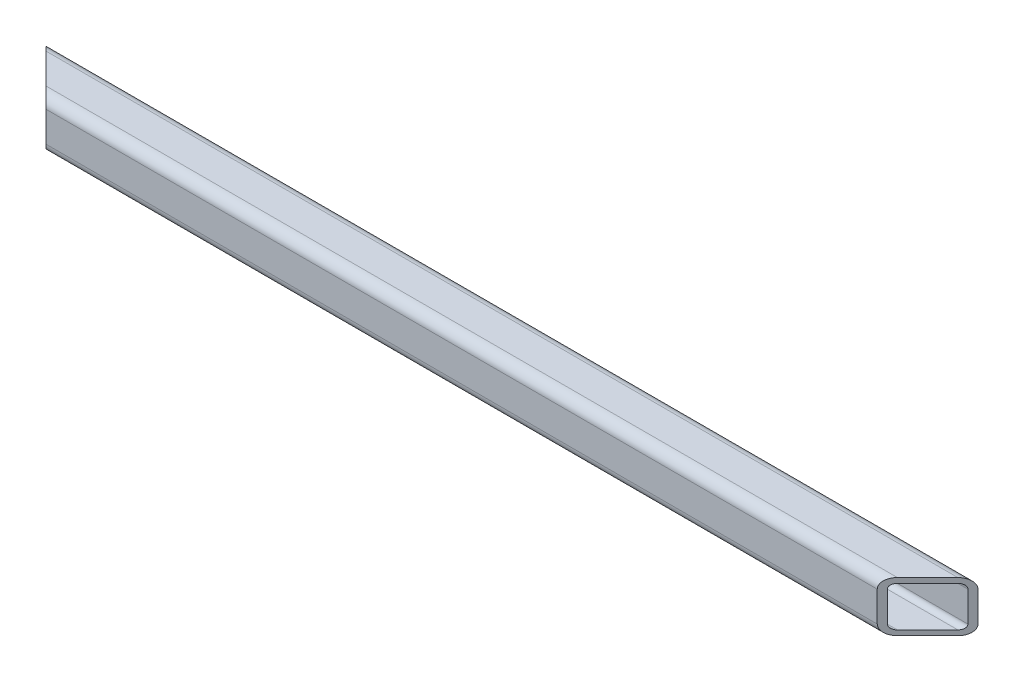
ISO-10303-21;
HEADER;
FILE_DESCRIPTION(('STEP AP214'),'2;1');
FILE_NAME('part.step','',(''),(''),'','','');
FILE_SCHEMA(('AUTOMOTIVE_DESIGN { 1 0 10303 214 1 1 1 1 }'));
ENDSEC;
DATA;
#1=APPLICATION_CONTEXT('core data for automotive mechanical design processes');
#2=APPLICATION_PROTOCOL_DEFINITION('international standard','automotive_design',2000,#1);
#3=PRODUCT_CONTEXT('',#1,'mechanical');
#4=PRODUCT('Part','Part','',(#3));
#5=PRODUCT_RELATED_PRODUCT_CATEGORY('part','',(#4));
#6=PRODUCT_DEFINITION_FORMATION('','',#4);
#7=PRODUCT_DEFINITION_CONTEXT('part definition',#1,'design');
#8=PRODUCT_DEFINITION('design','',#6,#7);
#9=PRODUCT_DEFINITION_SHAPE('','',#8);
#10=(LENGTH_UNIT() NAMED_UNIT(*) SI_UNIT(.MILLI.,.METRE.));
#11=(NAMED_UNIT(*) PLANE_ANGLE_UNIT() SI_UNIT($,.RADIAN.));
#12=(NAMED_UNIT(*) SI_UNIT($,.STERADIAN.) SOLID_ANGLE_UNIT());
#13=UNCERTAINTY_MEASURE_WITH_UNIT(LENGTH_MEASURE(1.E-05),#10,'distance_accuracy_value','');
#14=(GEOMETRIC_REPRESENTATION_CONTEXT(3) GLOBAL_UNCERTAINTY_ASSIGNED_CONTEXT((#13)) GLOBAL_UNIT_ASSIGNED_CONTEXT((#10,
#11,#12)) REPRESENTATION_CONTEXT('',''));
#15=CARTESIAN_POINT('',(0.,0.,0.));
#16=DIRECTION('',(0.,0.,1.));
#17=DIRECTION('',(1.,0.,0.));
#18=AXIS2_PLACEMENT_3D('',#15,#16,#17);
#19=CARTESIAN_POINT('',(-175.,6.00000000000001,-2294.));
#20=DIRECTION('',(1.,0.,0.));
#21=DIRECTION('',(0.,0.,-1.));
#22=AXIS2_PLACEMENT_3D('',#19,#20,#21);
#23=CYLINDRICAL_SURFACE('',#22,4.);
#24=CARTESIAN_POINT('',(169.,6.00000000000001,-2294.));
#25=DIRECTION('',(0.707106781186548,0.,0.707106781186548));
#26=DIRECTION('',(0.707106781186548,0.,-0.707106781186548));
#27=AXIS2_PLACEMENT_3D('',#24,#25,#26);
#28=ELLIPSE('',#27,5.65685424949238,4.);
#29=CARTESIAN_POINT('',(168.999999999999,10.,-2294.));
#30=VERTEX_POINT('',#29);
#31=CARTESIAN_POINT('',(165.,6.00000000000001,-2290.));
#32=VERTEX_POINT('',#31);
#33=EDGE_CURVE('E185',#30,#32,#28,.T.);
#34=ORIENTED_EDGE('',*,*,#33,.F.);
#35=DIRECTION('',(1.,0.,0.));
#36=VECTOR('',#35,1.);
#37=CARTESIAN_POINT('',(-175.,10.,-2294.));
#38=LINE('',#37,#36);
#39=CARTESIAN_POINT('',(-169.,10.,-2294.));
#40=VERTEX_POINT('',#39);
#41=EDGE_CURVE('E265',#40,#30,#38,.T.);
#42=ORIENTED_EDGE('',*,*,#41,.F.);
#43=CARTESIAN_POINT('',(-169.,6.00000000000001,-2294.));
#44=DIRECTION('',(-0.707106781186548,0.,0.707106781186548));
#45=DIRECTION('',(0.707106781186548,0.,0.707106781186548));
#46=AXIS2_PLACEMENT_3D('',#43,#44,#45);
#47=ELLIPSE('',#46,5.65685424949238,4.);
#48=CARTESIAN_POINT('',(-165.,6.00000000000001,-2290.));
#49=VERTEX_POINT('',#48);
#50=EDGE_CURVE('E176',#49,#40,#47,.T.);
#51=ORIENTED_EDGE('',*,*,#50,.F.);
#52=DIRECTION('',(1.,0.,0.));
#53=VECTOR('',#52,1.);
#54=CARTESIAN_POINT('',(-175.,6.00000000000001,-2290.));
#55=LINE('',#54,#53);
#56=EDGE_CURVE('E45',#49,#32,#55,.T.);
#57=ORIENTED_EDGE('',*,*,#56,.T.);
#58=EDGE_LOOP('',(#34,#42,#51,#57));
#59=FACE_BOUND('',#58,.T.);
#60=ADVANCED_FACE('F41',(#59),#23,.T.);
#61=CARTESIAN_POINT('',(-175.,10.,-2294.));
#62=DIRECTION('',(0.,-1.,0.));
#63=DIRECTION('',(0.,0.,-1.));
#64=AXIS2_PLACEMENT_3D('',#61,#62,#63);
#65=PLANE('',#64);
#66=DIRECTION('',(-0.707106781186548,0.,0.707106781186548));
#67=VECTOR('',#66,1.);
#68=CARTESIAN_POINT('',(-3.00000000000025,10.,-2122.));
#69=LINE('',#68,#67);
#70=CARTESIAN_POINT('',(181.,10.,-2306.));
#71=VERTEX_POINT('',#70);
#72=EDGE_CURVE('E182',#71,#30,#69,.T.);
#73=ORIENTED_EDGE('',*,*,#72,.F.);
#74=DIRECTION('',(1.,0.,0.));
#75=VECTOR('',#74,1.);
#76=CARTESIAN_POINT('',(-175.,10.,-2306.));
#77=LINE('',#76,#75);
#78=CARTESIAN_POINT('',(-181.,10.,-2306.));
#79=VERTEX_POINT('',#78);
#80=EDGE_CURVE('E263',#79,#71,#77,.T.);
#81=ORIENTED_EDGE('',*,*,#80,.F.);
#82=DIRECTION('',(-0.707106781186548,0.,-0.707106781186548));
#83=VECTOR('',#82,1.);
#84=CARTESIAN_POINT('',(-172.,10.,-2297.));
#85=LINE('',#84,#83);
#86=EDGE_CURVE('E281',#40,#79,#85,.T.);
#87=ORIENTED_EDGE('',*,*,#86,.F.);
#88=ORIENTED_EDGE('',*,*,#41,.T.);
#89=EDGE_LOOP('',(#73,#81,#87,#88));
#90=FACE_BOUND('',#89,.T.);
#91=ADVANCED_FACE('F272',(#90),#65,.F.);
#92=CARTESIAN_POINT('',(-175.,6.00000000000001,-2306.));
#93=DIRECTION('',(1.,0.,0.));
#94=DIRECTION('',(0.,0.,-1.));
#95=AXIS2_PLACEMENT_3D('',#92,#93,#94);
#96=CYLINDRICAL_SURFACE('',#95,4.);
#97=CARTESIAN_POINT('',(181.,6.00000000000001,-2306.));
#98=DIRECTION('',(0.707106781186548,0.,0.707106781186548));
#99=DIRECTION('',(0.707106781186548,0.,-0.707106781186548));
#100=AXIS2_PLACEMENT_3D('',#97,#98,#99);
#101=ELLIPSE('',#100,5.65685424949238,4.);
#102=CARTESIAN_POINT('',(185.,6.00000000000001,-2310.));
#103=VERTEX_POINT('',#102);
#104=EDGE_CURVE('E11',#103,#71,#101,.T.);
#105=ORIENTED_EDGE('',*,*,#104,.F.);
#106=DIRECTION('',(1.,0.,0.));
#107=VECTOR('',#106,1.);
#108=CARTESIAN_POINT('',(-175.,6.00000000000001,-2310.));
#109=LINE('',#108,#107);
#110=CARTESIAN_POINT('',(-185.,6.00000000000001,-2310.));
#111=VERTEX_POINT('',#110);
#112=EDGE_CURVE('E260',#111,#103,#109,.T.);
#113=ORIENTED_EDGE('',*,*,#112,.F.);
#114=CARTESIAN_POINT('',(-181.,6.00000000000001,-2306.));
#115=DIRECTION('',(-0.707106781186548,0.,0.707106781186548));
#116=DIRECTION('',(0.707106781186548,0.,0.707106781186548));
#117=AXIS2_PLACEMENT_3D('',#114,#115,#116);
#118=ELLIPSE('',#117,5.65685424949238,4.);
#119=EDGE_CURVE('E278',#79,#111,#118,.T.);
#120=ORIENTED_EDGE('',*,*,#119,.F.);
#121=ORIENTED_EDGE('',*,*,#80,.T.);
#122=EDGE_LOOP('',(#105,#113,#120,#121));
#123=FACE_BOUND('',#122,.T.);
#124=ADVANCED_FACE('F275',(#123),#96,.T.);
#125=CARTESIAN_POINT('',(-175.,-6.00000000000001,-2310.));
#126=DIRECTION('',(0.,0.,1.));
#127=DIRECTION('',(1.,0.,0.));
#128=AXIS2_PLACEMENT_3D('',#125,#126,#127);
#129=PLANE('',#128);
#130=DIRECTION('',(0.,1.,0.));
#131=VECTOR('',#130,1.);
#132=CARTESIAN_POINT('',(185.,-6.00000000000001,-2310.));
#133=LINE('',#132,#131);
#134=CARTESIAN_POINT('',(185.,-6.00000000000001,-2310.));
#135=VERTEX_POINT('',#134);
#136=EDGE_CURVE('E51',#135,#103,#133,.T.);
#137=ORIENTED_EDGE('',*,*,#136,.F.);
#138=DIRECTION('',(1.,0.,0.));
#139=VECTOR('',#138,1.);
#140=CARTESIAN_POINT('',(-175.,-6.00000000000001,-2310.));
#141=LINE('',#140,#139);
#142=CARTESIAN_POINT('',(-185.,-6.00000000000001,-2310.));
#143=VERTEX_POINT('',#142);
#144=EDGE_CURVE('E257',#143,#135,#141,.T.);
#145=ORIENTED_EDGE('',*,*,#144,.F.);
#146=DIRECTION('',(0.,-1.,0.));
#147=VECTOR('',#146,1.);
#148=CARTESIAN_POINT('',(-185.,-6.00000000000001,-2310.));
#149=LINE('',#148,#147);
#150=EDGE_CURVE('E280',#111,#143,#149,.T.);
#151=ORIENTED_EDGE('',*,*,#150,.F.);
#152=ORIENTED_EDGE('',*,*,#112,.T.);
#153=EDGE_LOOP('',(#137,#145,#151,#152));
#154=FACE_BOUND('',#153,.T.);
#155=ADVANCED_FACE('F291',(#154),#129,.F.);
#156=CARTESIAN_POINT('',(-175.,-6.00000000000001,-2306.));
#157=DIRECTION('',(1.,0.,0.));
#158=DIRECTION('',(0.,0.,-1.));
#159=AXIS2_PLACEMENT_3D('',#156,#157,#158);
#160=CYLINDRICAL_SURFACE('',#159,4.);
#161=CARTESIAN_POINT('',(181.,-6.00000000000001,-2306.));
#162=DIRECTION('',(0.707106781186548,0.,0.707106781186548));
#163=DIRECTION('',(0.707106781186548,0.,-0.707106781186548));
#164=AXIS2_PLACEMENT_3D('',#161,#162,#163);
#165=ELLIPSE('',#164,5.65685424949238,4.);
#166=CARTESIAN_POINT('',(181.,-10.,-2306.));
#167=VERTEX_POINT('',#166);
#168=EDGE_CURVE('E200',#167,#135,#165,.T.);
#169=ORIENTED_EDGE('',*,*,#168,.F.);
#170=DIRECTION('',(1.,0.,0.));
#171=VECTOR('',#170,1.);
#172=CARTESIAN_POINT('',(-175.,-10.,-2306.));
#173=LINE('',#172,#171);
#174=CARTESIAN_POINT('',(-181.,-10.,-2306.));
#175=VERTEX_POINT('',#174);
#176=EDGE_CURVE('E254',#175,#167,#173,.T.);
#177=ORIENTED_EDGE('',*,*,#176,.F.);
#178=CARTESIAN_POINT('',(-181.,-6.00000000000001,-2306.));
#179=DIRECTION('',(-0.707106781186548,0.,0.707106781186548));
#180=DIRECTION('',(0.707106781186548,0.,0.707106781186548));
#181=AXIS2_PLACEMENT_3D('',#178,#179,#180);
#182=ELLIPSE('',#181,5.65685424949238,4.);
#183=EDGE_CURVE('E187',#143,#175,#182,.T.);
#184=ORIENTED_EDGE('',*,*,#183,.F.);
#185=ORIENTED_EDGE('',*,*,#144,.T.);
#186=EDGE_LOOP('',(#169,#177,#184,#185));
#187=FACE_BOUND('',#186,.T.);
#188=ADVANCED_FACE('F289',(#187),#160,.T.);
#189=CARTESIAN_POINT('',(-175.,-10.,-2306.));
#190=DIRECTION('',(0.,1.,0.));
#191=DIRECTION('',(0.,0.,1.));
#192=AXIS2_PLACEMENT_3D('',#189,#190,#191);
#193=PLANE('',#192);
#194=DIRECTION('',(0.707106781186548,0.,-0.707106781186548));
#195=VECTOR('',#194,1.);
#196=CARTESIAN_POINT('',(2.99999999999998,-10.,-2128.));
#197=LINE('',#196,#195);
#198=CARTESIAN_POINT('',(169.,-10.,-2294.));
#199=VERTEX_POINT('',#198);
#200=EDGE_CURVE('E203',#199,#167,#197,.T.);
#201=ORIENTED_EDGE('',*,*,#200,.F.);
#202=DIRECTION('',(1.,0.,0.));
#203=VECTOR('',#202,1.);
#204=CARTESIAN_POINT('',(-175.,-10.,-2294.));
#205=LINE('',#204,#203);
#206=CARTESIAN_POINT('',(-169.,-10.,-2294.));
#207=VERTEX_POINT('',#206);
#208=EDGE_CURVE('E252',#207,#199,#205,.T.);
#209=ORIENTED_EDGE('',*,*,#208,.F.);
#210=DIRECTION('',(0.707106781186548,0.,0.707106781186548));
#211=VECTOR('',#210,1.);
#212=CARTESIAN_POINT('',(-178.,-10.,-2303.));
#213=LINE('',#212,#211);
#214=EDGE_CURVE('E181',#175,#207,#213,.T.);
#215=ORIENTED_EDGE('',*,*,#214,.F.);
#216=ORIENTED_EDGE('',*,*,#176,.T.);
#217=EDGE_LOOP('',(#201,#209,#215,#216));
#218=FACE_BOUND('',#217,.T.);
#219=ADVANCED_FACE('F293',(#218),#193,.F.);
#220=CARTESIAN_POINT('',(-175.,-6.00000000000001,-2294.));
#221=DIRECTION('',(1.,0.,0.));
#222=DIRECTION('',(0.,0.,-1.));
#223=AXIS2_PLACEMENT_3D('',#220,#221,#222);
#224=CYLINDRICAL_SURFACE('',#223,4.);
#225=CARTESIAN_POINT('',(169.,-6.00000000000001,-2294.));
#226=DIRECTION('',(0.707106781186548,0.,0.707106781186548));
#227=DIRECTION('',(0.707106781186548,0.,-0.707106781186548));
#228=AXIS2_PLACEMENT_3D('',#225,#226,#227);
#229=ELLIPSE('',#228,5.65685424949238,4.);
#230=CARTESIAN_POINT('',(165.,-6.00000000000001,-2290.));
#231=VERTEX_POINT('',#230);
#232=EDGE_CURVE('E164',#231,#199,#229,.T.);
#233=ORIENTED_EDGE('',*,*,#232,.F.);
#234=DIRECTION('',(1.,0.,0.));
#235=VECTOR('',#234,1.);
#236=CARTESIAN_POINT('',(-175.,-6.00000000000001,-2290.));
#237=LINE('',#236,#235);
#238=CARTESIAN_POINT('',(-165.,-6.00000000000001,-2290.));
#239=VERTEX_POINT('',#238);
#240=EDGE_CURVE('E156',#239,#231,#237,.T.);
#241=ORIENTED_EDGE('',*,*,#240,.F.);
#242=CARTESIAN_POINT('',(-169.,-6.00000000000001,-2294.));
#243=DIRECTION('',(-0.707106781186548,0.,0.707106781186548));
#244=DIRECTION('',(0.707106781186548,0.,0.707106781186548));
#245=AXIS2_PLACEMENT_3D('',#242,#243,#244);
#246=ELLIPSE('',#245,5.65685424949238,4.);
#247=EDGE_CURVE('E161',#207,#239,#246,.T.);
#248=ORIENTED_EDGE('',*,*,#247,.F.);
#249=ORIENTED_EDGE('',*,*,#208,.T.);
#250=EDGE_LOOP('',(#233,#241,#248,#249));
#251=FACE_BOUND('',#250,.T.);
#252=ADVANCED_FACE('F158',(#251),#224,.T.);
#253=CARTESIAN_POINT('',(-175.,6.00000000000001,-2306.));
#254=DIRECTION('',(1.,0.,0.));
#255=DIRECTION('',(0.,0.,-1.));
#256=AXIS2_PLACEMENT_3D('',#253,#254,#255);
#257=CYLINDRICAL_SURFACE('',#256,2.);
#258=DIRECTION('',(1.,0.,0.));
#259=VECTOR('',#258,1.);
#260=CARTESIAN_POINT('',(-175.,6.00000000000001,-2308.));
#261=LINE('',#260,#259);
#262=CARTESIAN_POINT('',(-183.,6.00000000000001,-2308.));
#263=VERTEX_POINT('',#262);
#264=CARTESIAN_POINT('',(183.,6.00000000000001,-2308.));
#265=VERTEX_POINT('',#264);
#266=EDGE_CURVE('E209',#263,#265,#261,.T.);
#267=ORIENTED_EDGE('',*,*,#266,.T.);
#268=CARTESIAN_POINT('',(181.,6.00000000000001,-2306.));
#269=DIRECTION('',(0.707106781186548,0.,0.707106781186548));
#270=DIRECTION('',(0.707106781186548,0.,-0.707106781186548));
#271=AXIS2_PLACEMENT_3D('',#268,#269,#270);
#272=ELLIPSE('',#271,2.82842712474619,2.);
#273=CARTESIAN_POINT('',(181.,8.00000000000001,-2306.));
#274=VERTEX_POINT('',#273);
#275=EDGE_CURVE('E87',#265,#274,#272,.T.);
#276=ORIENTED_EDGE('',*,*,#275,.T.);
#277=DIRECTION('',(1.,0.,0.));
#278=VECTOR('',#277,1.);
#279=CARTESIAN_POINT('',(-175.,8.00000000000001,-2306.));
#280=LINE('',#279,#278);
#281=CARTESIAN_POINT('',(-181.,8.00000000000001,-2306.));
#282=VERTEX_POINT('',#281);
#283=EDGE_CURVE('E212',#282,#274,#280,.T.);
#284=ORIENTED_EDGE('',*,*,#283,.F.);
#285=CARTESIAN_POINT('',(-181.,6.00000000000001,-2306.));
#286=DIRECTION('',(-0.707106781186548,0.,0.707106781186548));
#287=DIRECTION('',(0.707106781186548,0.,0.707106781186548));
#288=AXIS2_PLACEMENT_3D('',#285,#286,#287);
#289=ELLIPSE('',#288,2.82842712474619,2.);
#290=EDGE_CURVE('E208',#282,#263,#289,.T.);
#291=ORIENTED_EDGE('',*,*,#290,.T.);
#292=EDGE_LOOP('',(#267,#276,#284,#291));
#293=FACE_BOUND('',#292,.T.);
#294=ADVANCED_FACE('F301',(#293),#257,.F.);
#295=CARTESIAN_POINT('',(-175.,8.00000000000001,-2294.));
#296=DIRECTION('',(0.,-1.,0.));
#297=DIRECTION('',(0.,0.,-1.));
#298=AXIS2_PLACEMENT_3D('',#295,#296,#297);
#299=PLANE('',#298);
#300=ORIENTED_EDGE('',*,*,#283,.T.);
#301=DIRECTION('',(-0.707106781186548,0.,0.707106781186548));
#302=VECTOR('',#301,1.);
#303=CARTESIAN_POINT('',(-3.00000000000025,8.00000000000001,-2122.));
#304=LINE('',#303,#302);
#305=CARTESIAN_POINT('',(169.,8.00000000000001,-2294.));
#306=VERTEX_POINT('',#305);
#307=EDGE_CURVE('E60',#274,#306,#304,.T.);
#308=ORIENTED_EDGE('',*,*,#307,.T.);
#309=DIRECTION('',(1.,0.,0.));
#310=VECTOR('',#309,1.);
#311=CARTESIAN_POINT('',(-175.,8.00000000000001,-2294.));
#312=LINE('',#311,#310);
#313=CARTESIAN_POINT('',(-169.,8.00000000000001,-2294.));
#314=VERTEX_POINT('',#313);
#315=EDGE_CURVE('E217',#314,#306,#312,.T.);
#316=ORIENTED_EDGE('',*,*,#315,.F.);
#317=DIRECTION('',(-0.707106781186548,0.,-0.707106781186548));
#318=VECTOR('',#317,1.);
#319=CARTESIAN_POINT('',(-172.,8.00000000000001,-2297.));
#320=LINE('',#319,#318);
#321=EDGE_CURVE('E211',#314,#282,#320,.T.);
#322=ORIENTED_EDGE('',*,*,#321,.T.);
#323=EDGE_LOOP('',(#300,#308,#316,#322));
#324=FACE_BOUND('',#323,.T.);
#325=ADVANCED_FACE('F349',(#324),#299,.T.);
#326=CARTESIAN_POINT('',(-175.,6.00000000000001,-2294.));
#327=DIRECTION('',(1.,0.,0.));
#328=DIRECTION('',(0.,0.,-1.));
#329=AXIS2_PLACEMENT_3D('',#326,#327,#328);
#330=CYLINDRICAL_SURFACE('',#329,2.);
#331=ORIENTED_EDGE('',*,*,#315,.T.);
#332=CARTESIAN_POINT('',(169.,6.00000000000001,-2294.));
#333=DIRECTION('',(0.707106781186548,0.,0.707106781186548));
#334=DIRECTION('',(0.707106781186548,0.,-0.707106781186548));
#335=AXIS2_PLACEMENT_3D('',#332,#333,#334);
#336=ELLIPSE('',#335,2.82842712474619,2.);
#337=CARTESIAN_POINT('',(167.,6.00000000000001,-2292.));
#338=VERTEX_POINT('',#337);
#339=EDGE_CURVE('E213',#306,#338,#336,.T.);
#340=ORIENTED_EDGE('',*,*,#339,.T.);
#341=DIRECTION('',(1.,0.,0.));
#342=VECTOR('',#341,1.);
#343=CARTESIAN_POINT('',(-175.,6.00000000000001,-2292.));
#344=LINE('',#343,#342);
#345=CARTESIAN_POINT('',(-167.,6.00000000000001,-2292.));
#346=VERTEX_POINT('',#345);
#347=EDGE_CURVE('E222',#346,#338,#344,.T.);
#348=ORIENTED_EDGE('',*,*,#347,.F.);
#349=CARTESIAN_POINT('',(-169.,6.00000000000001,-2294.));
#350=DIRECTION('',(-0.707106781186548,0.,0.707106781186548));
#351=DIRECTION('',(0.707106781186548,0.,0.707106781186548));
#352=AXIS2_PLACEMENT_3D('',#349,#350,#351);
#353=ELLIPSE('',#352,2.82842712474619,2.);
#354=EDGE_CURVE('E216',#346,#314,#353,.T.);
#355=ORIENTED_EDGE('',*,*,#354,.T.);
#356=EDGE_LOOP('',(#331,#340,#348,#355));
#357=FACE_BOUND('',#356,.T.);
#358=ADVANCED_FACE('F357',(#357),#330,.F.);
#359=CARTESIAN_POINT('',(-175.,6.00000000000001,-2292.));
#360=DIRECTION('',(0.,0.,-1.));
#361=DIRECTION('',(-1.,0.,0.));
#362=AXIS2_PLACEMENT_3D('',#359,#360,#361);
#363=PLANE('',#362);
#364=ORIENTED_EDGE('',*,*,#347,.T.);
#365=DIRECTION('',(0.,-1.,0.));
#366=VECTOR('',#365,1.);
#367=CARTESIAN_POINT('',(167.,6.00000000000001,-2292.));
#368=LINE('',#367,#366);
#369=CARTESIAN_POINT('',(167.,-6.00000000000001,-2292.));
#370=VERTEX_POINT('',#369);
#371=EDGE_CURVE('E218',#338,#370,#368,.T.);
#372=ORIENTED_EDGE('',*,*,#371,.T.);
#373=DIRECTION('',(1.,0.,0.));
#374=VECTOR('',#373,1.);
#375=CARTESIAN_POINT('',(-175.,-6.00000000000001,-2292.));
#376=LINE('',#375,#374);
#377=CARTESIAN_POINT('',(-167.,-6.00000000000001,-2292.));
#378=VERTEX_POINT('',#377);
#379=EDGE_CURVE('E227',#378,#370,#376,.T.);
#380=ORIENTED_EDGE('',*,*,#379,.F.);
#381=DIRECTION('',(0.,1.,0.));
#382=VECTOR('',#381,1.);
#383=CARTESIAN_POINT('',(-167.,6.00000000000001,-2292.));
#384=LINE('',#383,#382);
#385=EDGE_CURVE('E221',#378,#346,#384,.T.);
#386=ORIENTED_EDGE('',*,*,#385,.T.);
#387=EDGE_LOOP('',(#364,#372,#380,#386));
#388=FACE_BOUND('',#387,.T.);
#389=ADVANCED_FACE('F365',(#388),#363,.T.);
#390=CARTESIAN_POINT('',(-175.,-6.00000000000001,-2294.));
#391=DIRECTION('',(1.,0.,0.));
#392=DIRECTION('',(0.,0.,-1.));
#393=AXIS2_PLACEMENT_3D('',#390,#391,#392);
#394=CYLINDRICAL_SURFACE('',#393,2.);
#395=ORIENTED_EDGE('',*,*,#379,.T.);
#396=CARTESIAN_POINT('',(169.,-6.00000000000001,-2294.));
#397=DIRECTION('',(0.707106781186548,0.,0.707106781186548));
#398=DIRECTION('',(0.707106781186548,0.,-0.707106781186548));
#399=AXIS2_PLACEMENT_3D('',#396,#397,#398);
#400=ELLIPSE('',#399,2.82842712474619,2.);
#401=CARTESIAN_POINT('',(168.999999999999,-8.00000000000001,-2294.));
#402=VERTEX_POINT('',#401);
#403=EDGE_CURVE('E223',#370,#402,#400,.T.);
#404=ORIENTED_EDGE('',*,*,#403,.T.);
#405=DIRECTION('',(1.,0.,0.));
#406=VECTOR('',#405,1.);
#407=CARTESIAN_POINT('',(-175.,-8.00000000000001,-2294.));
#408=LINE('',#407,#406);
#409=CARTESIAN_POINT('',(-169.,-8.00000000000001,-2294.));
#410=VERTEX_POINT('',#409);
#411=EDGE_CURVE('E232',#410,#402,#408,.T.);
#412=ORIENTED_EDGE('',*,*,#411,.F.);
#413=CARTESIAN_POINT('',(-169.,-6.00000000000001,-2294.));
#414=DIRECTION('',(-0.707106781186548,0.,0.707106781186548));
#415=DIRECTION('',(0.707106781186548,0.,0.707106781186548));
#416=AXIS2_PLACEMENT_3D('',#413,#414,#415);
#417=ELLIPSE('',#416,2.82842712474619,2.);
#418=EDGE_CURVE('E226',#410,#378,#417,.T.);
#419=ORIENTED_EDGE('',*,*,#418,.T.);
#420=EDGE_LOOP('',(#395,#404,#412,#419));
#421=FACE_BOUND('',#420,.T.);
#422=ADVANCED_FACE('F373',(#421),#394,.F.);
#423=CARTESIAN_POINT('',(-175.,-8.00000000000001,-2306.));
#424=DIRECTION('',(0.,1.,0.));
#425=DIRECTION('',(0.,0.,1.));
#426=AXIS2_PLACEMENT_3D('',#423,#424,#425);
#427=PLANE('',#426);
#428=ORIENTED_EDGE('',*,*,#411,.T.);
#429=DIRECTION('',(0.707106781186548,0.,-0.707106781186548));
#430=VECTOR('',#429,1.);
#431=CARTESIAN_POINT('',(2.99999999999998,-8.00000000000001,-2128.));
#432=LINE('',#431,#430);
#433=CARTESIAN_POINT('',(181.,-8.00000000000001,-2306.));
#434=VERTEX_POINT('',#433);
#435=EDGE_CURVE('E228',#402,#434,#432,.T.);
#436=ORIENTED_EDGE('',*,*,#435,.T.);
#437=DIRECTION('',(1.,0.,0.));
#438=VECTOR('',#437,1.);
#439=CARTESIAN_POINT('',(-175.,-8.00000000000001,-2306.));
#440=LINE('',#439,#438);
#441=CARTESIAN_POINT('',(-181.,-8.00000000000001,-2306.));
#442=VERTEX_POINT('',#441);
#443=EDGE_CURVE('E236',#442,#434,#440,.T.);
#444=ORIENTED_EDGE('',*,*,#443,.F.);
#445=DIRECTION('',(0.707106781186548,0.,0.707106781186548));
#446=VECTOR('',#445,1.);
#447=CARTESIAN_POINT('',(-178.,-8.00000000000001,-2303.));
#448=LINE('',#447,#446);
#449=EDGE_CURVE('E231',#442,#410,#448,.T.);
#450=ORIENTED_EDGE('',*,*,#449,.T.);
#451=EDGE_LOOP('',(#428,#436,#444,#450));
#452=FACE_BOUND('',#451,.T.);
#453=ADVANCED_FACE('F381',(#452),#427,.T.);
#454=CARTESIAN_POINT('',(-175.,-6.00000000000001,-2306.));
#455=DIRECTION('',(1.,0.,0.));
#456=DIRECTION('',(0.,0.,-1.));
#457=AXIS2_PLACEMENT_3D('',#454,#455,#456);
#458=CYLINDRICAL_SURFACE('',#457,2.);
#459=ORIENTED_EDGE('',*,*,#443,.T.);
#460=CARTESIAN_POINT('',(181.,-6.00000000000001,-2306.));
#461=DIRECTION('',(0.707106781186548,0.,0.707106781186548));
#462=DIRECTION('',(0.707106781186548,0.,-0.707106781186548));
#463=AXIS2_PLACEMENT_3D('',#460,#461,#462);
#464=ELLIPSE('',#463,2.82842712474619,2.);
#465=CARTESIAN_POINT('',(183.,-6.00000000000001,-2308.));
#466=VERTEX_POINT('',#465);
#467=EDGE_CURVE('E233',#434,#466,#464,.T.);
#468=ORIENTED_EDGE('',*,*,#467,.T.);
#469=DIRECTION('',(1.,0.,0.));
#470=VECTOR('',#469,1.);
#471=CARTESIAN_POINT('',(-175.,-6.00000000000001,-2308.));
#472=LINE('',#471,#470);
#473=CARTESIAN_POINT('',(-183.,-6.00000000000001,-2308.));
#474=VERTEX_POINT('',#473);
#475=EDGE_CURVE('E194',#474,#466,#472,.T.);
#476=ORIENTED_EDGE('',*,*,#475,.F.);
#477=CARTESIAN_POINT('',(-181.,-6.00000000000001,-2306.));
#478=DIRECTION('',(-0.707106781186548,0.,0.707106781186548));
#479=DIRECTION('',(0.707106781186548,0.,0.707106781186548));
#480=AXIS2_PLACEMENT_3D('',#477,#478,#479);
#481=ELLIPSE('',#480,2.82842712474619,2.);
#482=EDGE_CURVE('E235',#474,#442,#481,.T.);
#483=ORIENTED_EDGE('',*,*,#482,.T.);
#484=EDGE_LOOP('',(#459,#468,#476,#483));
#485=FACE_BOUND('',#484,.T.);
#486=ADVANCED_FACE('F389',(#485),#458,.F.);
#487=CARTESIAN_POINT('',(-175.,-6.00000000000001,-2308.));
#488=DIRECTION('',(0.,0.,1.));
#489=DIRECTION('',(1.,0.,0.));
#490=AXIS2_PLACEMENT_3D('',#487,#488,#489);
#491=PLANE('',#490);
#492=ORIENTED_EDGE('',*,*,#475,.T.);
#493=DIRECTION('',(0.,1.,0.));
#494=VECTOR('',#493,1.);
#495=CARTESIAN_POINT('',(183.,-6.00000000000001,-2308.));
#496=LINE('',#495,#494);
#497=EDGE_CURVE('E82',#466,#265,#496,.T.);
#498=ORIENTED_EDGE('',*,*,#497,.T.);
#499=ORIENTED_EDGE('',*,*,#266,.F.);
#500=DIRECTION('',(0.,-1.,0.));
#501=VECTOR('',#500,1.);
#502=CARTESIAN_POINT('',(-183.,-6.00000000000001,-2308.));
#503=LINE('',#502,#501);
#504=EDGE_CURVE('E169',#263,#474,#503,.T.);
#505=ORIENTED_EDGE('',*,*,#504,.T.);
#506=EDGE_LOOP('',(#492,#498,#499,#505));
#507=FACE_BOUND('',#506,.T.);
#508=ADVANCED_FACE('F397',(#507),#491,.T.);
#509=CARTESIAN_POINT('',(-175.,6.00000000000001,-2290.));
#510=DIRECTION('',(0.,0.,-1.));
#511=DIRECTION('',(-1.,0.,0.));
#512=AXIS2_PLACEMENT_3D('',#509,#510,#511);
#513=PLANE('',#512);
#514=DIRECTION('',(0.,-1.,0.));
#515=VECTOR('',#514,1.);
#516=CARTESIAN_POINT('',(165.,6.00000000000001,-2290.));
#517=LINE('',#516,#515);
#518=EDGE_CURVE('E196',#32,#231,#517,.T.);
#519=ORIENTED_EDGE('',*,*,#518,.F.);
#520=ORIENTED_EDGE('',*,*,#56,.F.);
#521=DIRECTION('',(0.,1.,0.));
#522=VECTOR('',#521,1.);
#523=CARTESIAN_POINT('',(-165.,6.00000000000001,-2290.));
#524=LINE('',#523,#522);
#525=EDGE_CURVE('E168',#239,#49,#524,.T.);
#526=ORIENTED_EDGE('',*,*,#525,.F.);
#527=ORIENTED_EDGE('',*,*,#240,.T.);
#528=EDGE_LOOP('',(#519,#520,#526,#527));
#529=FACE_BOUND('',#528,.T.);
#530=ADVANCED_FACE('F172',(#529),#513,.F.);
#531=CARTESIAN_POINT('',(-175.,0.,-2300.));
#532=DIRECTION('',(-0.707106781186548,0.,0.707106781186548));
#533=DIRECTION('',(0.707106781186548,0.,0.707106781186548));
#534=AXIS2_PLACEMENT_3D('',#531,#532,#533);
#535=PLANE('',#534);
#536=ORIENTED_EDGE('',*,*,#290,.F.);
#537=ORIENTED_EDGE('',*,*,#321,.F.);
#538=ORIENTED_EDGE('',*,*,#354,.F.);
#539=ORIENTED_EDGE('',*,*,#385,.F.);
#540=ORIENTED_EDGE('',*,*,#418,.F.);
#541=ORIENTED_EDGE('',*,*,#449,.F.);
#542=ORIENTED_EDGE('',*,*,#482,.F.);
#543=ORIENTED_EDGE('',*,*,#504,.F.);
#544=EDGE_LOOP('',(#536,#537,#538,#539,#540,#541,#542,#543));
#545=FACE_BOUND('',#544,.T.);
#546=ORIENTED_EDGE('',*,*,#525,.T.);
#547=ORIENTED_EDGE('',*,*,#50,.T.);
#548=ORIENTED_EDGE('',*,*,#86,.T.);
#549=ORIENTED_EDGE('',*,*,#119,.T.);
#550=ORIENTED_EDGE('',*,*,#150,.T.);
#551=ORIENTED_EDGE('',*,*,#183,.T.);
#552=ORIENTED_EDGE('',*,*,#214,.T.);
#553=ORIENTED_EDGE('',*,*,#247,.T.);
#554=EDGE_LOOP('',(#546,#547,#548,#549,#550,#551,#552,#553));
#555=FACE_BOUND('',#554,.T.);
#556=ADVANCED_FACE('F179',(#545,#555),#535,.T.);
#557=CARTESIAN_POINT('',(175.,0.,-2300.));
#558=DIRECTION('',(0.707106781186548,0.,0.707106781186548));
#559=DIRECTION('',(0.707106781186548,0.,-0.707106781186548));
#560=AXIS2_PLACEMENT_3D('',#557,#558,#559);
#561=PLANE('',#560);
#562=ORIENTED_EDGE('',*,*,#275,.F.);
#563=ORIENTED_EDGE('',*,*,#497,.F.);
#564=ORIENTED_EDGE('',*,*,#467,.F.);
#565=ORIENTED_EDGE('',*,*,#435,.F.);
#566=ORIENTED_EDGE('',*,*,#403,.F.);
#567=ORIENTED_EDGE('',*,*,#371,.F.);
#568=ORIENTED_EDGE('',*,*,#339,.F.);
#569=ORIENTED_EDGE('',*,*,#307,.F.);
#570=EDGE_LOOP('',(#562,#563,#564,#565,#566,#567,#568,#569));
#571=FACE_BOUND('',#570,.T.);
#572=ORIENTED_EDGE('',*,*,#72,.T.);
#573=ORIENTED_EDGE('',*,*,#33,.T.);
#574=ORIENTED_EDGE('',*,*,#518,.T.);
#575=ORIENTED_EDGE('',*,*,#232,.T.);
#576=ORIENTED_EDGE('',*,*,#200,.T.);
#577=ORIENTED_EDGE('',*,*,#168,.T.);
#578=ORIENTED_EDGE('',*,*,#136,.T.);
#579=ORIENTED_EDGE('',*,*,#104,.T.);
#580=EDGE_LOOP('',(#572,#573,#574,#575,#576,#577,#578,#579));
#581=FACE_BOUND('',#580,.T.);
#582=ADVANCED_FACE('F43',(#571,#581),#561,.T.);
#583=CLOSED_SHELL('',(#60,#91,#124,#155,#188,#219,#252,#294,#325,#358,#389,#422,#453,#486,#508,
#530,#556,#582));
#584=MANIFOLD_SOLID_BREP('B2',#583);
#585=ADVANCED_BREP_SHAPE_REPRESENTATION('',(#18,#584),#14);
#586=SHAPE_DEFINITION_REPRESENTATION(#9,#585);
ENDSEC;
END-ISO-10303-21;
